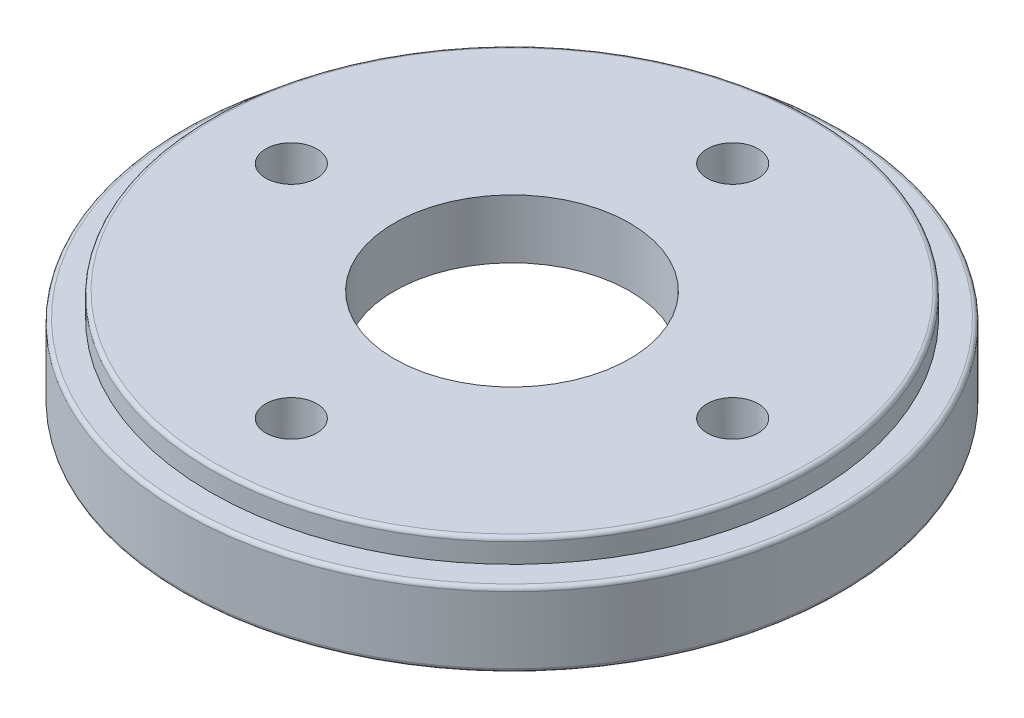
ISO-10303-21;
HEADER;
FILE_DESCRIPTION(('STEP AP214'),'2;1');
FILE_NAME('part.step','',(''),(''),'','','');
FILE_SCHEMA(('AUTOMOTIVE_DESIGN { 1 0 10303 214 1 1 1 1 }'));
ENDSEC;
DATA;
#1=APPLICATION_CONTEXT('core data for automotive mechanical design processes');
#2=APPLICATION_PROTOCOL_DEFINITION('international standard','automotive_design',2000,#1);
#3=PRODUCT_CONTEXT('',#1,'mechanical');
#4=PRODUCT('Part','Part','',(#3));
#5=PRODUCT_RELATED_PRODUCT_CATEGORY('part','',(#4));
#6=PRODUCT_DEFINITION_FORMATION('','',#4);
#7=PRODUCT_DEFINITION_CONTEXT('part definition',#1,'design');
#8=PRODUCT_DEFINITION('design','',#6,#7);
#9=PRODUCT_DEFINITION_SHAPE('','',#8);
#10=(LENGTH_UNIT() NAMED_UNIT(*) SI_UNIT(.MILLI.,.METRE.));
#11=(NAMED_UNIT(*) PLANE_ANGLE_UNIT() SI_UNIT($,.RADIAN.));
#12=(NAMED_UNIT(*) SI_UNIT($,.STERADIAN.) SOLID_ANGLE_UNIT());
#13=UNCERTAINTY_MEASURE_WITH_UNIT(LENGTH_MEASURE(1.E-05),#10,'distance_accuracy_value','');
#14=(GEOMETRIC_REPRESENTATION_CONTEXT(3) GLOBAL_UNCERTAINTY_ASSIGNED_CONTEXT((#13)) GLOBAL_UNIT_ASSIGNED_CONTEXT((#10,
#11,#12)) REPRESENTATION_CONTEXT('',''));
#15=CARTESIAN_POINT('',(0.,0.,0.));
#16=DIRECTION('',(0.,0.,1.));
#17=DIRECTION('',(1.,0.,0.));
#18=AXIS2_PLACEMENT_3D('',#15,#16,#17);
#19=CARTESIAN_POINT('',(0.,5.,11.25));
#20=DIRECTION('',(0.,-1.,0.));
#21=DIRECTION('',(0.,0.,1.));
#22=AXIS2_PLACEMENT_3D('',#19,#20,#21);
#23=CYLINDRICAL_SURFACE('',#22,1.3);
#24=CARTESIAN_POINT('',(0.,5.,11.25));
#25=DIRECTION('',(0.,-1.,0.));
#26=DIRECTION('',(0.,0.,-1.));
#27=AXIS2_PLACEMENT_3D('',#24,#25,#26);
#28=CIRCLE('',#27,1.3);
#29=CARTESIAN_POINT('',(0.,5.,9.95));
#30=VERTEX_POINT('',#29);
#31=EDGE_CURVE('E70',#30,#30,#28,.T.);
#32=ORIENTED_EDGE('',*,*,#31,.F.);
#33=EDGE_LOOP('',(#32));
#34=FACE_BOUND('',#33,.T.);
#35=CARTESIAN_POINT('',(0.,2.,11.25));
#36=DIRECTION('',(0.,1.,0.));
#37=DIRECTION('',(0.,0.,1.));
#38=AXIS2_PLACEMENT_3D('',#35,#36,#37);
#39=CIRCLE('',#38,1.3);
#40=CARTESIAN_POINT('',(0.,2.,12.55));
#41=VERTEX_POINT('',#40);
#42=EDGE_CURVE('E88',#41,#41,#39,.T.);
#43=ORIENTED_EDGE('',*,*,#42,.F.);
#44=EDGE_LOOP('',(#43));
#45=FACE_BOUND('',#44,.T.);
#46=ADVANCED_FACE('F39',(#34,#45),#23,.F.);
#47=CARTESIAN_POINT('',(0.,5.,0.));
#48=DIRECTION('',(0.,-1.,0.));
#49=DIRECTION('',(0.,0.,1.));
#50=AXIS2_PLACEMENT_3D('',#47,#48,#49);
#51=CYLINDRICAL_SURFACE('',#50,6.);
#52=CARTESIAN_POINT('',(0.,5.,0.));
#53=DIRECTION('',(0.,-1.,0.));
#54=DIRECTION('',(0.,0.,-1.));
#55=AXIS2_PLACEMENT_3D('',#52,#53,#54);
#56=CIRCLE('',#55,6.);
#57=CARTESIAN_POINT('',(0.,5.,-6.));
#58=VERTEX_POINT('',#57);
#59=EDGE_CURVE('E73',#58,#58,#56,.T.);
#60=ORIENTED_EDGE('',*,*,#59,.F.);
#61=EDGE_LOOP('',(#60));
#62=FACE_BOUND('',#61,.T.);
#63=CARTESIAN_POINT('',(0.,2.,0.));
#64=DIRECTION('',(0.,1.,0.));
#65=DIRECTION('',(0.,0.,1.));
#66=AXIS2_PLACEMENT_3D('',#63,#64,#65);
#67=CIRCLE('',#66,6.);
#68=CARTESIAN_POINT('',(0.,2.,6.));
#69=VERTEX_POINT('',#68);
#70=EDGE_CURVE('E91',#69,#69,#67,.T.);
#71=ORIENTED_EDGE('',*,*,#70,.F.);
#72=EDGE_LOOP('',(#71));
#73=FACE_BOUND('',#72,.T.);
#74=ADVANCED_FACE('F120',(#62,#73),#51,.F.);
#75=CARTESIAN_POINT('',(11.2500000000003,5.,3.17677639618484E-13));
#76=DIRECTION('',(0.,-1.,0.));
#77=DIRECTION('',(0.,0.,1.));
#78=AXIS2_PLACEMENT_3D('',#75,#76,#77);
#79=CYLINDRICAL_SURFACE('',#78,1.30000000000025);
#80=CARTESIAN_POINT('',(11.2500000000003,5.,3.17677639618484E-13));
#81=DIRECTION('',(0.,-1.,0.));
#82=DIRECTION('',(0.,0.,-1.));
#83=AXIS2_PLACEMENT_3D('',#80,#81,#82);
#84=CIRCLE('',#83,1.30000000000025);
#85=CARTESIAN_POINT('',(11.2500000000003,5.,-1.29999999999993));
#86=VERTEX_POINT('',#85);
#87=EDGE_CURVE('E76',#86,#86,#84,.T.);
#88=ORIENTED_EDGE('',*,*,#87,.F.);
#89=EDGE_LOOP('',(#88));
#90=FACE_BOUND('',#89,.T.);
#91=CARTESIAN_POINT('',(11.2500000000003,2.,3.17677639618484E-13));
#92=DIRECTION('',(0.,1.,0.));
#93=DIRECTION('',(0.,0.,1.));
#94=AXIS2_PLACEMENT_3D('',#91,#92,#93);
#95=CIRCLE('',#94,1.30000000000025);
#96=CARTESIAN_POINT('',(11.2500000000003,2.,1.30000000000057));
#97=VERTEX_POINT('',#96);
#98=EDGE_CURVE('E94',#97,#97,#95,.T.);
#99=ORIENTED_EDGE('',*,*,#98,.F.);
#100=EDGE_LOOP('',(#99));
#101=FACE_BOUND('',#100,.T.);
#102=ADVANCED_FACE('F126',(#90,#101),#79,.F.);
#103=CARTESIAN_POINT('',(6.35355279236968E-13,5.,-11.25));
#104=DIRECTION('',(0.,-1.,0.));
#105=DIRECTION('',(0.,0.,1.));
#106=AXIS2_PLACEMENT_3D('',#103,#104,#105);
#107=CYLINDRICAL_SURFACE('',#106,1.30000000000068);
#108=CARTESIAN_POINT('',(6.35355279236968E-13,5.,-11.25));
#109=DIRECTION('',(0.,-1.,0.));
#110=DIRECTION('',(0.,0.,-1.));
#111=AXIS2_PLACEMENT_3D('',#108,#109,#110);
#112=CIRCLE('',#111,1.30000000000068);
#113=CARTESIAN_POINT('',(6.35355279236968E-13,5.,-12.5500000000007));
#114=VERTEX_POINT('',#113);
#115=EDGE_CURVE('E79',#114,#114,#112,.T.);
#116=ORIENTED_EDGE('',*,*,#115,.F.);
#117=EDGE_LOOP('',(#116));
#118=FACE_BOUND('',#117,.T.);
#119=CARTESIAN_POINT('',(6.35355279236968E-13,2.,-11.25));
#120=DIRECTION('',(0.,1.,0.));
#121=DIRECTION('',(0.,0.,1.));
#122=AXIS2_PLACEMENT_3D('',#119,#120,#121);
#123=CIRCLE('',#122,1.30000000000068);
#124=CARTESIAN_POINT('',(6.35355279236968E-13,2.,-9.94999999999932));
#125=VERTEX_POINT('',#124);
#126=EDGE_CURVE('E59',#125,#125,#123,.T.);
#127=ORIENTED_EDGE('',*,*,#126,.F.);
#128=EDGE_LOOP('',(#127));
#129=FACE_BOUND('',#128,.T.);
#130=ADVANCED_FACE('F168',(#118,#129),#107,.F.);
#131=CARTESIAN_POINT('',(-11.2499999999997,5.,-3.19055367267525E-13));
#132=DIRECTION('',(0.,-1.,0.));
#133=DIRECTION('',(0.,0.,1.));
#134=AXIS2_PLACEMENT_3D('',#131,#132,#133);
#135=CYLINDRICAL_SURFACE('',#134,1.30000000000051);
#136=CARTESIAN_POINT('',(-11.2499999999997,5.,-3.19055367267525E-13));
#137=DIRECTION('',(0.,-1.,0.));
#138=DIRECTION('',(0.,0.,-1.));
#139=AXIS2_PLACEMENT_3D('',#136,#137,#138);
#140=CIRCLE('',#139,1.30000000000051);
#141=CARTESIAN_POINT('',(-11.2499999999997,5.,-1.30000000000083));
#142=VERTEX_POINT('',#141);
#143=EDGE_CURVE('E82',#142,#142,#140,.T.);
#144=ORIENTED_EDGE('',*,*,#143,.F.);
#145=EDGE_LOOP('',(#144));
#146=FACE_BOUND('',#145,.T.);
#147=CARTESIAN_POINT('',(-11.2499999999997,2.,-3.19055367267525E-13));
#148=DIRECTION('',(0.,1.,0.));
#149=DIRECTION('',(0.,0.,1.));
#150=AXIS2_PLACEMENT_3D('',#147,#148,#149);
#151=CIRCLE('',#150,1.30000000000051);
#152=CARTESIAN_POINT('',(-11.2499999999997,2.,1.30000000000019));
#153=VERTEX_POINT('',#152);
#154=EDGE_CURVE('E57',#153,#153,#151,.T.);
#155=ORIENTED_EDGE('',*,*,#154,.F.);
#156=EDGE_LOOP('',(#155));
#157=FACE_BOUND('',#156,.T.);
#158=ADVANCED_FACE('F137',(#146,#157),#135,.F.);
#159=CARTESIAN_POINT('',(0.,5.,0.));
#160=DIRECTION('',(0.,1.,0.));
#161=DIRECTION('',(0.,0.,-1.));
#162=AXIS2_PLACEMENT_3D('',#159,#160,#161);
#163=PLANE('',#162);
#164=CARTESIAN_POINT('',(0.,5.,0.));
#165=DIRECTION('',(0.,-1.,0.));
#166=DIRECTION('',(0.,0.,-1.));
#167=AXIS2_PLACEMENT_3D('',#164,#165,#166);
#168=CIRCLE('',#167,15.175);
#169=CARTESIAN_POINT('',(0.,5.,-15.175));
#170=VERTEX_POINT('',#169);
#171=EDGE_CURVE('E54',#170,#170,#168,.T.);
#172=ORIENTED_EDGE('',*,*,#171,.F.);
#173=EDGE_LOOP('',(#172));
#174=FACE_BOUND('',#173,.T.);
#175=ORIENTED_EDGE('',*,*,#143,.T.);
#176=EDGE_LOOP('',(#175));
#177=FACE_BOUND('',#176,.T.);
#178=ORIENTED_EDGE('',*,*,#87,.T.);
#179=EDGE_LOOP('',(#178));
#180=FACE_BOUND('',#179,.T.);
#181=ORIENTED_EDGE('',*,*,#31,.T.);
#182=EDGE_LOOP('',(#181));
#183=FACE_BOUND('',#182,.T.);
#184=ORIENTED_EDGE('',*,*,#59,.T.);
#185=EDGE_LOOP('',(#184));
#186=FACE_BOUND('',#185,.T.);
#187=ORIENTED_EDGE('',*,*,#115,.T.);
#188=EDGE_LOOP('',(#187));
#189=FACE_BOUND('',#188,.T.);
#190=ADVANCED_FACE('F133',(#174,#177,#180,#183,#186,#189),#163,.T.);
#191=CARTESIAN_POINT('',(0.,5.,0.));
#192=DIRECTION('',(0.,-1.,0.));
#193=DIRECTION('',(0.,0.,1.));
#194=AXIS2_PLACEMENT_3D('',#191,#192,#193);
#195=CYLINDRICAL_SURFACE('',#194,16.8);
#196=CARTESIAN_POINT('',(0.,0.2,0.));
#197=DIRECTION('',(0.,-1.,0.));
#198=DIRECTION('',(0.,0.,-1.));
#199=AXIS2_PLACEMENT_3D('',#196,#197,#198);
#200=CIRCLE('',#199,16.8);
#201=CARTESIAN_POINT('',(0.,0.2,-16.8));
#202=VERTEX_POINT('',#201);
#203=EDGE_CURVE('E46',#202,#202,#200,.T.);
#204=ORIENTED_EDGE('',*,*,#203,.F.);
#205=EDGE_LOOP('',(#204));
#206=FACE_BOUND('',#205,.T.);
#207=CARTESIAN_POINT('',(0.,3.6,0.));
#208=DIRECTION('',(0.,-1.,0.));
#209=DIRECTION('',(0.,0.,-1.));
#210=AXIS2_PLACEMENT_3D('',#207,#208,#209);
#211=CIRCLE('',#210,16.8);
#212=CARTESIAN_POINT('',(0.,3.6,-16.8));
#213=VERTEX_POINT('',#212);
#214=EDGE_CURVE('E64',#213,#213,#211,.F.);
#215=ORIENTED_EDGE('',*,*,#214,.F.);
#216=EDGE_LOOP('',(#215));
#217=FACE_BOUND('',#216,.T.);
#218=ADVANCED_FACE('F136',(#206,#217),#195,.T.);
#219=CARTESIAN_POINT('',(0.,0.,0.));
#220=DIRECTION('',(0.,1.,0.));
#221=DIRECTION('',(0.,0.,-1.));
#222=AXIS2_PLACEMENT_3D('',#219,#220,#221);
#223=PLANE('',#222);
#224=CARTESIAN_POINT('',(0.,0.,0.));
#225=DIRECTION('',(0.,-1.,0.));
#226=DIRECTION('',(0.,0.,-1.));
#227=AXIS2_PLACEMENT_3D('',#224,#225,#226);
#228=CIRCLE('',#227,16.6);
#229=CARTESIAN_POINT('',(0.,0.,-16.6));
#230=VERTEX_POINT('',#229);
#231=EDGE_CURVE('E10',#230,#230,#228,.F.);
#232=ORIENTED_EDGE('',*,*,#231,.F.);
#233=EDGE_LOOP('',(#232));
#234=FACE_BOUND('',#233,.T.);
#235=CARTESIAN_POINT('',(0.,0.,0.));
#236=DIRECTION('',(0.,1.,0.));
#237=DIRECTION('',(0.,0.,1.));
#238=AXIS2_PLACEMENT_3D('',#235,#236,#237);
#239=CIRCLE('',#238,14.8);
#240=CARTESIAN_POINT('',(0.,0.,14.8));
#241=VERTEX_POINT('',#240);
#242=EDGE_CURVE('E99',#241,#241,#239,.T.);
#243=ORIENTED_EDGE('',*,*,#242,.T.);
#244=EDGE_LOOP('',(#243));
#245=FACE_BOUND('',#244,.T.);
#246=ADVANCED_FACE('F139',(#234,#245),#223,.F.);
#247=CARTESIAN_POINT('',(0.,3.8,0.));
#248=DIRECTION('',(0.,1.,0.));
#249=DIRECTION('',(0.,0.,-1.));
#250=AXIS2_PLACEMENT_3D('',#247,#248,#249);
#251=PLANE('',#250);
#252=CARTESIAN_POINT('',(0.,3.8,0.));
#253=DIRECTION('',(0.,-1.,0.));
#254=DIRECTION('',(0.,0.,-1.));
#255=AXIS2_PLACEMENT_3D('',#252,#253,#254);
#256=CIRCLE('',#255,16.6);
#257=CARTESIAN_POINT('',(0.,3.8,-16.6));
#258=VERTEX_POINT('',#257);
#259=EDGE_CURVE('E67',#258,#258,#256,.T.);
#260=ORIENTED_EDGE('',*,*,#259,.F.);
#261=EDGE_LOOP('',(#260));
#262=FACE_BOUND('',#261,.T.);
#263=CARTESIAN_POINT('',(0.,3.8,0.));
#264=DIRECTION('',(0.,-1.,0.));
#265=DIRECTION('',(0.,0.,-1.));
#266=AXIS2_PLACEMENT_3D('',#263,#264,#265);
#267=CIRCLE('',#266,15.375);
#268=CARTESIAN_POINT('',(0.,3.8,-15.375));
#269=VERTEX_POINT('',#268);
#270=EDGE_CURVE('E85',#269,#269,#267,.T.);
#271=ORIENTED_EDGE('',*,*,#270,.T.);
#272=EDGE_LOOP('',(#271));
#273=FACE_BOUND('',#272,.T.);
#274=ADVANCED_FACE('F142',(#262,#273),#251,.T.);
#275=CARTESIAN_POINT('',(0.,3.8,0.));
#276=DIRECTION('',(0.,1.,0.));
#277=DIRECTION('',(0.,0.,-1.));
#278=AXIS2_PLACEMENT_3D('',#275,#276,#277);
#279=CYLINDRICAL_SURFACE('',#278,15.375);
#280=CARTESIAN_POINT('',(0.,4.8,0.));
#281=DIRECTION('',(0.,-1.,0.));
#282=DIRECTION('',(0.,0.,-1.));
#283=AXIS2_PLACEMENT_3D('',#280,#281,#282);
#284=CIRCLE('',#283,15.375);
#285=CARTESIAN_POINT('',(0.,4.8,-15.375));
#286=VERTEX_POINT('',#285);
#287=EDGE_CURVE('E50',#286,#286,#284,.F.);
#288=ORIENTED_EDGE('',*,*,#287,.F.);
#289=EDGE_LOOP('',(#288));
#290=FACE_BOUND('',#289,.T.);
#291=ORIENTED_EDGE('',*,*,#270,.F.);
#292=EDGE_LOOP('',(#291));
#293=FACE_BOUND('',#292,.T.);
#294=ADVANCED_FACE('F149',(#290,#293),#279,.T.);
#295=CARTESIAN_POINT('',(0.,3.6,0.));
#296=DIRECTION('',(0.,1.,0.));
#297=DIRECTION('',(0.,0.,-1.));
#298=AXIS2_PLACEMENT_3D('',#295,#296,#297);
#299=TOROIDAL_SURFACE('',#298,16.6,0.2);
#300=ORIENTED_EDGE('',*,*,#214,.T.);
#301=EDGE_LOOP('',(#300));
#302=FACE_BOUND('',#301,.T.);
#303=ORIENTED_EDGE('',*,*,#259,.T.);
#304=EDGE_LOOP('',(#303));
#305=FACE_BOUND('',#304,.T.);
#306=ADVANCED_FACE('F147',(#302,#305),#299,.T.);
#307=CARTESIAN_POINT('',(0.,4.8,0.));
#308=DIRECTION('',(0.,1.,0.));
#309=DIRECTION('',(0.,0.,-1.));
#310=AXIS2_PLACEMENT_3D('',#307,#308,#309);
#311=TOROIDAL_SURFACE('',#310,15.175,0.2);
#312=ORIENTED_EDGE('',*,*,#287,.T.);
#313=EDGE_LOOP('',(#312));
#314=FACE_BOUND('',#313,.T.);
#315=ORIENTED_EDGE('',*,*,#171,.T.);
#316=EDGE_LOOP('',(#315));
#317=FACE_BOUND('',#316,.T.);
#318=ADVANCED_FACE('F116',(#314,#317),#311,.T.);
#319=CARTESIAN_POINT('',(0.,2.,0.));
#320=DIRECTION('',(0.,-1.,0.));
#321=DIRECTION('',(0.,0.,1.));
#322=AXIS2_PLACEMENT_3D('',#319,#320,#321);
#323=CYLINDRICAL_SURFACE('',#322,14.8);
#324=CARTESIAN_POINT('',(0.,2.,0.));
#325=DIRECTION('',(0.,1.,0.));
#326=DIRECTION('',(0.,0.,1.));
#327=AXIS2_PLACEMENT_3D('',#324,#325,#326);
#328=CIRCLE('',#327,14.8);
#329=CARTESIAN_POINT('',(0.,2.,14.8));
#330=VERTEX_POINT('',#329);
#331=EDGE_CURVE('E60',#330,#330,#328,.T.);
#332=ORIENTED_EDGE('',*,*,#331,.T.);
#333=EDGE_LOOP('',(#332));
#334=FACE_BOUND('',#333,.T.);
#335=ORIENTED_EDGE('',*,*,#242,.F.);
#336=EDGE_LOOP('',(#335));
#337=FACE_BOUND('',#336,.T.);
#338=ADVANCED_FACE('F105',(#334,#337),#323,.F.);
#339=CARTESIAN_POINT('',(0.,2.,0.));
#340=DIRECTION('',(0.,-1.,0.));
#341=DIRECTION('',(0.,0.,1.));
#342=AXIS2_PLACEMENT_3D('',#339,#340,#341);
#343=PLANE('',#342);
#344=ORIENTED_EDGE('',*,*,#42,.T.);
#345=EDGE_LOOP('',(#344));
#346=FACE_BOUND('',#345,.T.);
#347=ORIENTED_EDGE('',*,*,#70,.T.);
#348=EDGE_LOOP('',(#347));
#349=FACE_BOUND('',#348,.T.);
#350=ORIENTED_EDGE('',*,*,#98,.T.);
#351=EDGE_LOOP('',(#350));
#352=FACE_BOUND('',#351,.T.);
#353=ORIENTED_EDGE('',*,*,#126,.T.);
#354=EDGE_LOOP('',(#353));
#355=FACE_BOUND('',#354,.T.);
#356=ORIENTED_EDGE('',*,*,#154,.T.);
#357=EDGE_LOOP('',(#356));
#358=FACE_BOUND('',#357,.T.);
#359=ORIENTED_EDGE('',*,*,#331,.F.);
#360=EDGE_LOOP('',(#359));
#361=FACE_BOUND('',#360,.T.);
#362=ADVANCED_FACE('F108',(#346,#349,#352,#355,#358,#361),#343,.T.);
#363=CARTESIAN_POINT('',(0.,0.2,0.));
#364=DIRECTION('',(0.,1.,0.));
#365=DIRECTION('',(0.,0.,-1.));
#366=AXIS2_PLACEMENT_3D('',#363,#364,#365);
#367=TOROIDAL_SURFACE('',#366,16.6,0.2);
#368=ORIENTED_EDGE('',*,*,#231,.T.);
#369=EDGE_LOOP('',(#368));
#370=FACE_BOUND('',#369,.T.);
#371=ORIENTED_EDGE('',*,*,#203,.T.);
#372=EDGE_LOOP('',(#371));
#373=FACE_BOUND('',#372,.T.);
#374=ADVANCED_FACE('F41',(#370,#373),#367,.T.);
#375=CLOSED_SHELL('',(#46,#74,#102,#130,#158,#190,#218,#246,#274,#294,#306,#318,#338,#362,#374));
#376=MANIFOLD_SOLID_BREP('B2',#375);
#377=ADVANCED_BREP_SHAPE_REPRESENTATION('',(#18,#376),#14);
#378=SHAPE_DEFINITION_REPRESENTATION(#9,#377);
ENDSEC;
END-ISO-10303-21;
